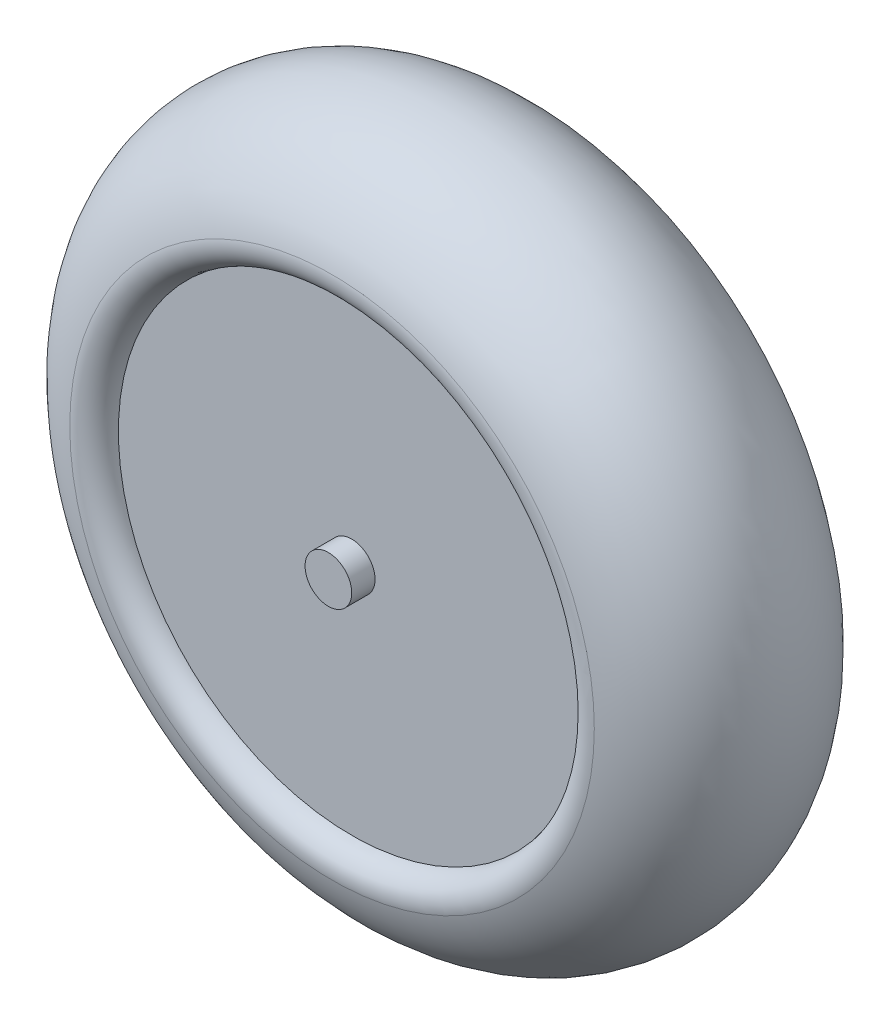
ISO-10303-21;
HEADER;
FILE_DESCRIPTION(('STEP AP214'),'2;1');
FILE_NAME('part.step','',(''),(''),'','','');
FILE_SCHEMA(('AUTOMOTIVE_DESIGN { 1 0 10303 214 1 1 1 1 }'));
ENDSEC;
DATA;
#1=APPLICATION_CONTEXT('core data for automotive mechanical design processes');
#2=APPLICATION_PROTOCOL_DEFINITION('international standard','automotive_design',2000,#1);
#3=PRODUCT_CONTEXT('',#1,'mechanical');
#4=PRODUCT('Part','Part','',(#3));
#5=PRODUCT_RELATED_PRODUCT_CATEGORY('part','',(#4));
#6=PRODUCT_DEFINITION_FORMATION('','',#4);
#7=PRODUCT_DEFINITION_CONTEXT('part definition',#1,'design');
#8=PRODUCT_DEFINITION('design','',#6,#7);
#9=PRODUCT_DEFINITION_SHAPE('','',#8);
#10=(LENGTH_UNIT() NAMED_UNIT(*) SI_UNIT(.MILLI.,.METRE.));
#11=(NAMED_UNIT(*) PLANE_ANGLE_UNIT() SI_UNIT($,.RADIAN.));
#12=(NAMED_UNIT(*) SI_UNIT($,.STERADIAN.) SOLID_ANGLE_UNIT());
#13=UNCERTAINTY_MEASURE_WITH_UNIT(LENGTH_MEASURE(1.E-05),#10,'distance_accuracy_value','');
#14=(GEOMETRIC_REPRESENTATION_CONTEXT(3) GLOBAL_UNCERTAINTY_ASSIGNED_CONTEXT((#13)) GLOBAL_UNIT_ASSIGNED_CONTEXT((#10,
#11,#12)) REPRESENTATION_CONTEXT('',''));
#15=CARTESIAN_POINT('',(0.,0.,0.));
#16=DIRECTION('',(0.,0.,1.));
#17=DIRECTION('',(1.,0.,0.));
#18=AXIS2_PLACEMENT_3D('',#15,#16,#17);
#19=CARTESIAN_POINT('',(0.,0.,10.16));
#20=DIRECTION('',(0.,0.,1.));
#21=DIRECTION('',(1.,0.,0.));
#22=AXIS2_PLACEMENT_3D('',#19,#20,#21);
#23=PLANE('',#22);
#24=CARTESIAN_POINT('',(0.,0.,10.16));
#25=DIRECTION('',(0.,0.,1.));
#26=DIRECTION('',(1.,0.,0.));
#27=AXIS2_PLACEMENT_3D('',#24,#25,#26);
#28=CIRCLE('',#27,25.4);
#29=CARTESIAN_POINT('',(25.4,0.,10.16));
#30=VERTEX_POINT('',#29);
#31=EDGE_CURVE('E46',#30,#30,#28,.T.);
#32=ORIENTED_EDGE('',*,*,#31,.T.);
#33=EDGE_LOOP('',(#32));
#34=FACE_BOUND('',#33,.T.);
#35=CARTESIAN_POINT('',(0.,0.,10.16));
#36=DIRECTION('',(0.,0.,1.));
#37=DIRECTION('',(1.,0.,0.));
#38=AXIS2_PLACEMENT_3D('',#35,#36,#37);
#39=CIRCLE('',#38,2.54);
#40=CARTESIAN_POINT('',(2.54,0.,10.16));
#41=VERTEX_POINT('',#40);
#42=EDGE_CURVE('E52',#41,#41,#39,.T.);
#43=ORIENTED_EDGE('',*,*,#42,.F.);
#44=EDGE_LOOP('',(#43));
#45=FACE_BOUND('',#44,.T.);
#46=ADVANCED_FACE('F31',(#34,#45),#23,.T.);
#47=CARTESIAN_POINT('',(0.,0.,0.));
#48=DIRECTION('',(0.,0.,1.));
#49=DIRECTION('',(1.,0.,0.));
#50=AXIS2_PLACEMENT_3D('',#47,#48,#49);
#51=TOROIDAL_SURFACE('',#50,25.4,12.7);
#52=CARTESIAN_POINT('',(0.,0.,-12.3031249999999));
#53=DIRECTION('',(0.,0.,1.));
#54=DIRECTION('',(1.,0.,0.));
#55=AXIS2_PLACEMENT_3D('',#52,#53,#54);
#56=CIRCLE('',#55,28.5500976547363);
#57=CARTESIAN_POINT('',(28.5500976547363,0.,-12.3031249999999));
#58=VERTEX_POINT('',#57);
#59=EDGE_CURVE('E10',#58,#58,#56,.T.);
#60=ORIENTED_EDGE('',*,*,#59,.T.);
#61=EDGE_LOOP('',(#60));
#62=FACE_BOUND('',#61,.T.);
#63=CARTESIAN_POINT('',(0.,0.,12.3031249999999));
#64=DIRECTION('',(0.,0.,-1.));
#65=DIRECTION('',(-1.,0.,0.));
#66=AXIS2_PLACEMENT_3D('',#63,#64,#65);
#67=CIRCLE('',#66,28.5500976547363);
#68=CARTESIAN_POINT('',(-28.5500976547363,0.,12.3031249999999));
#69=VERTEX_POINT('',#68);
#70=EDGE_CURVE('E38',#69,#69,#67,.T.);
#71=ORIENTED_EDGE('',*,*,#70,.T.);
#72=EDGE_LOOP('',(#71));
#73=FACE_BOUND('',#72,.T.);
#74=ADVANCED_FACE('F79',(#62,#73),#51,.T.);
#75=CARTESIAN_POINT('',(0.,0.,-10.16));
#76=DIRECTION('',(0.,0.,1.));
#77=DIRECTION('',(1.,0.,0.));
#78=AXIS2_PLACEMENT_3D('',#75,#76,#77);
#79=PLANE('',#78);
#80=CARTESIAN_POINT('',(0.,0.,-10.16));
#81=DIRECTION('',(0.,0.,1.));
#82=DIRECTION('',(1.,0.,0.));
#83=AXIS2_PLACEMENT_3D('',#80,#81,#82);
#84=CIRCLE('',#83,2.54);
#85=CARTESIAN_POINT('',(2.54,0.,-10.16));
#86=VERTEX_POINT('',#85);
#87=EDGE_CURVE('E58',#86,#86,#84,.T.);
#88=ORIENTED_EDGE('',*,*,#87,.T.);
#89=EDGE_LOOP('',(#88));
#90=FACE_BOUND('',#89,.T.);
#91=CARTESIAN_POINT('',(0.,0.,-10.16));
#92=DIRECTION('',(0.,0.,1.));
#93=DIRECTION('',(1.,0.,0.));
#94=AXIS2_PLACEMENT_3D('',#91,#92,#93);
#95=CIRCLE('',#94,25.4);
#96=CARTESIAN_POINT('',(25.4,0.,-10.16));
#97=VERTEX_POINT('',#96);
#98=EDGE_CURVE('E42',#97,#97,#95,.F.);
#99=ORIENTED_EDGE('',*,*,#98,.T.);
#100=EDGE_LOOP('',(#99));
#101=FACE_BOUND('',#100,.T.);
#102=ADVANCED_FACE('F85',(#90,#101),#79,.F.);
#103=CARTESIAN_POINT('',(0.,0.,12.7));
#104=DIRECTION('',(0.,0.,-1.));
#105=DIRECTION('',(-1.,0.,0.));
#106=AXIS2_PLACEMENT_3D('',#103,#104,#105);
#107=CYLINDRICAL_SURFACE('',#106,2.54);
#108=CARTESIAN_POINT('',(0.,0.,12.7));
#109=DIRECTION('',(0.,0.,1.));
#110=DIRECTION('',(1.,0.,0.));
#111=AXIS2_PLACEMENT_3D('',#108,#109,#110);
#112=CIRCLE('',#111,2.54);
#113=CARTESIAN_POINT('',(2.54,0.,12.7));
#114=VERTEX_POINT('',#113);
#115=EDGE_CURVE('E51',#114,#114,#112,.T.);
#116=ORIENTED_EDGE('',*,*,#115,.F.);
#117=EDGE_LOOP('',(#116));
#118=FACE_BOUND('',#117,.T.);
#119=ORIENTED_EDGE('',*,*,#42,.T.);
#120=EDGE_LOOP('',(#119));
#121=FACE_BOUND('',#120,.T.);
#122=ADVANCED_FACE('F90',(#118,#121),#107,.T.);
#123=CARTESIAN_POINT('',(0.,0.,12.7));
#124=DIRECTION('',(0.,0.,1.));
#125=DIRECTION('',(1.,0.,0.));
#126=AXIS2_PLACEMENT_3D('',#123,#124,#125);
#127=PLANE('',#126);
#128=ORIENTED_EDGE('',*,*,#115,.T.);
#129=EDGE_LOOP('',(#128));
#130=FACE_BOUND('',#129,.T.);
#131=ADVANCED_FACE('F76',(#130),#127,.T.);
#132=CARTESIAN_POINT('',(0.,0.,-12.7));
#133=DIRECTION('',(0.,0.,1.));
#134=DIRECTION('',(1.,0.,0.));
#135=AXIS2_PLACEMENT_3D('',#132,#133,#134);
#136=CYLINDRICAL_SURFACE('',#135,2.54);
#137=CARTESIAN_POINT('',(0.,0.,-12.7));
#138=DIRECTION('',(0.,0.,1.));
#139=DIRECTION('',(1.,0.,0.));
#140=AXIS2_PLACEMENT_3D('',#137,#138,#139);
#141=CIRCLE('',#140,2.54);
#142=CARTESIAN_POINT('',(2.54,0.,-12.7));
#143=VERTEX_POINT('',#142);
#144=EDGE_CURVE('E55',#143,#143,#141,.T.);
#145=ORIENTED_EDGE('',*,*,#144,.T.);
#146=EDGE_LOOP('',(#145));
#147=FACE_BOUND('',#146,.T.);
#148=ORIENTED_EDGE('',*,*,#87,.F.);
#149=EDGE_LOOP('',(#148));
#150=FACE_BOUND('',#149,.T.);
#151=ADVANCED_FACE('F64',(#147,#150),#136,.T.);
#152=CARTESIAN_POINT('',(0.,0.,-12.7));
#153=DIRECTION('',(0.,0.,-1.));
#154=DIRECTION('',(1.,0.,0.));
#155=AXIS2_PLACEMENT_3D('',#152,#153,#154);
#156=PLANE('',#155);
#157=ORIENTED_EDGE('',*,*,#144,.F.);
#158=EDGE_LOOP('',(#157));
#159=FACE_BOUND('',#158,.T.);
#160=ADVANCED_FACE('F67',(#159),#156,.T.);
#161=CARTESIAN_POINT('',(0.,0.,-9.8425));
#162=DIRECTION('',(0.,0.,-1.));
#163=DIRECTION('',(-1.,0.,0.));
#164=AXIS2_PLACEMENT_3D('',#161,#162,#163);
#165=TOROIDAL_SURFACE('',#164,27.920078123789,2.54);
#166=ORIENTED_EDGE('',*,*,#98,.F.);
#167=EDGE_LOOP('',(#166));
#168=FACE_BOUND('',#167,.T.);
#169=ORIENTED_EDGE('',*,*,#59,.F.);
#170=EDGE_LOOP('',(#169));
#171=FACE_BOUND('',#170,.T.);
#172=ADVANCED_FACE('F69',(#168,#171),#165,.T.);
#173=CARTESIAN_POINT('',(0.,0.,9.8425));
#174=DIRECTION('',(0.,0.,-1.));
#175=DIRECTION('',(-1.,0.,0.));
#176=AXIS2_PLACEMENT_3D('',#173,#174,#175);
#177=TOROIDAL_SURFACE('',#176,27.920078123789,2.54);
#178=ORIENTED_EDGE('',*,*,#70,.F.);
#179=EDGE_LOOP('',(#178));
#180=FACE_BOUND('',#179,.T.);
#181=ORIENTED_EDGE('',*,*,#31,.F.);
#182=EDGE_LOOP('',(#181));
#183=FACE_BOUND('',#182,.T.);
#184=ADVANCED_FACE('F33',(#180,#183),#177,.T.);
#185=CLOSED_SHELL('',(#46,#74,#102,#122,#131,#151,#160,#172,#184));
#186=MANIFOLD_SOLID_BREP('B2',#185);
#187=ADVANCED_BREP_SHAPE_REPRESENTATION('',(#18,#186),#14);
#188=SHAPE_DEFINITION_REPRESENTATION(#9,#187);
ENDSEC;
END-ISO-10303-21;
